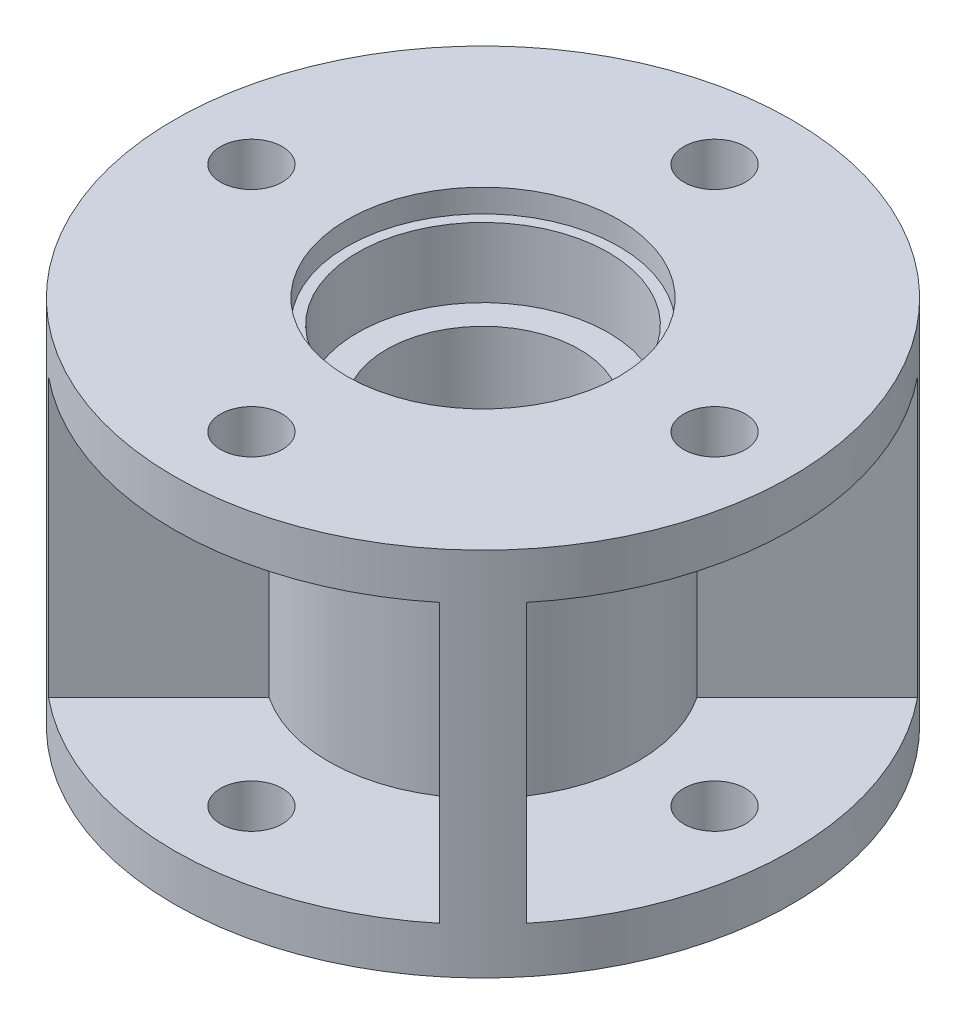
ISO-10303-21;
HEADER;
FILE_DESCRIPTION(('STEP AP214'),'2;1');
FILE_NAME('part.step','',(''),(''),'','','');
FILE_SCHEMA(('AUTOMOTIVE_DESIGN { 1 0 10303 214 1 1 1 1 }'));
ENDSEC;
DATA;
#1=APPLICATION_CONTEXT('core data for automotive mechanical design processes');
#2=APPLICATION_PROTOCOL_DEFINITION('international standard','automotive_design',2000,#1);
#3=PRODUCT_CONTEXT('',#1,'mechanical');
#4=PRODUCT('Part','Part','',(#3));
#5=PRODUCT_RELATED_PRODUCT_CATEGORY('part','',(#4));
#6=PRODUCT_DEFINITION_FORMATION('','',#4);
#7=PRODUCT_DEFINITION_CONTEXT('part definition',#1,'design');
#8=PRODUCT_DEFINITION('design','',#6,#7);
#9=PRODUCT_DEFINITION_SHAPE('','',#8);
#10=(LENGTH_UNIT() NAMED_UNIT(*) SI_UNIT(.MILLI.,.METRE.));
#11=(NAMED_UNIT(*) PLANE_ANGLE_UNIT() SI_UNIT($,.RADIAN.));
#12=(NAMED_UNIT(*) SI_UNIT($,.STERADIAN.) SOLID_ANGLE_UNIT());
#13=UNCERTAINTY_MEASURE_WITH_UNIT(LENGTH_MEASURE(1.E-05),#10,'distance_accuracy_value','');
#14=(GEOMETRIC_REPRESENTATION_CONTEXT(3) GLOBAL_UNCERTAINTY_ASSIGNED_CONTEXT((#13)) GLOBAL_UNIT_ASSIGNED_CONTEXT((#10,
#11,#12)) REPRESENTATION_CONTEXT('',''));
#15=CARTESIAN_POINT('',(0.,0.,0.));
#16=DIRECTION('',(0.,0.,1.));
#17=DIRECTION('',(1.,0.,0.));
#18=AXIS2_PLACEMENT_3D('',#15,#16,#17);
#19=CARTESIAN_POINT('',(0.,36.,0.));
#20=DIRECTION('',(0.,-1.,0.));
#21=DIRECTION('',(0.,0.,-1.));
#22=AXIS2_PLACEMENT_3D('',#19,#20,#21);
#23=CYLINDRICAL_SURFACE('',#22,20.);
#24=CARTESIAN_POINT('',(0.,42.,0.));
#25=DIRECTION('',(0.,1.,0.));
#26=DIRECTION('',(0.,0.,1.));
#27=AXIS2_PLACEMENT_3D('',#24,#25,#26);
#28=CIRCLE('',#27,20.);
#29=CARTESIAN_POINT('',(-11.0279793358048,42.,16.6848335852972));
#30=VERTEX_POINT('',#29);
#31=CARTESIAN_POINT('',(11.0279793358047,42.,16.6848335852973));
#32=VERTEX_POINT('',#31);
#33=EDGE_CURVE('E145',#30,#32,#28,.T.);
#34=ORIENTED_EDGE('',*,*,#33,.F.);
#35=DIRECTION('',(0.,-1.,0.));
#36=VECTOR('',#35,1.);
#37=CARTESIAN_POINT('',(-11.0279793358048,76.2035795419994,16.6848335852972));
#38=LINE('',#37,#36);
#39=CARTESIAN_POINT('',(-11.0279793358048,6.,16.6848335852972));
#40=VERTEX_POINT('',#39);
#41=EDGE_CURVE('E201',#30,#40,#38,.T.);
#42=ORIENTED_EDGE('',*,*,#41,.T.);
#43=CARTESIAN_POINT('',(0.,6.,0.));
#44=DIRECTION('',(0.,1.,0.));
#45=DIRECTION('',(0.,0.,1.));
#46=AXIS2_PLACEMENT_3D('',#43,#44,#45);
#47=CIRCLE('',#46,20.);
#48=CARTESIAN_POINT('',(11.0279793358047,6.,16.6848335852973));
#49=VERTEX_POINT('',#48);
#50=EDGE_CURVE('E170',#40,#49,#47,.T.);
#51=ORIENTED_EDGE('',*,*,#50,.T.);
#52=DIRECTION('',(0.,-1.,0.));
#53=VECTOR('',#52,1.);
#54=CARTESIAN_POINT('',(11.0279793358047,76.2035795419994,16.6848335852973));
#55=LINE('',#54,#53);
#56=EDGE_CURVE('E162',#32,#49,#55,.T.);
#57=ORIENTED_EDGE('',*,*,#56,.F.);
#58=EDGE_LOOP('',(#34,#42,#51,#57));
#59=FACE_BOUND('',#58,.T.);
#60=ADVANCED_FACE('F35',(#59),#23,.T.);
#61=CARTESIAN_POINT('',(16.6848335852971,42.,11.027979335805));
#62=VERTEX_POINT('',#61);
#63=CARTESIAN_POINT('',(16.6848335852973,42.,-11.0279793358048));
#64=VERTEX_POINT('',#63);
#65=EDGE_CURVE('E157',#62,#64,#28,.T.);
#66=ORIENTED_EDGE('',*,*,#65,.F.);
#67=DIRECTION('',(0.,-1.,0.));
#68=VECTOR('',#67,1.);
#69=CARTESIAN_POINT('',(16.6848335852971,76.2035795419994,11.027979335805));
#70=LINE('',#69,#68);
#71=CARTESIAN_POINT('',(16.6848335852971,6.,11.027979335805));
#72=VERTEX_POINT('',#71);
#73=EDGE_CURVE('E172',#62,#72,#70,.T.);
#74=ORIENTED_EDGE('',*,*,#73,.T.);
#75=CARTESIAN_POINT('',(16.6848335852973,6.,-11.0279793358048));
#76=VERTEX_POINT('',#75);
#77=EDGE_CURVE('E236',#72,#76,#47,.T.);
#78=ORIENTED_EDGE('',*,*,#77,.T.);
#79=DIRECTION('',(0.,-1.,0.));
#80=VECTOR('',#79,1.);
#81=CARTESIAN_POINT('',(16.6848335852973,76.2035795419994,-11.0279793358048));
#82=LINE('',#81,#80);
#83=EDGE_CURVE('E192',#64,#76,#82,.T.);
#84=ORIENTED_EDGE('',*,*,#83,.F.);
#85=EDGE_LOOP('',(#66,#74,#78,#84));
#86=FACE_BOUND('',#85,.T.);
#87=ADVANCED_FACE('F349',(#86),#23,.T.);
#88=CARTESIAN_POINT('',(11.0279793358049,42.,-16.6848335852972));
#89=VERTEX_POINT('',#88);
#90=CARTESIAN_POINT('',(-11.0279793358048,42.,-16.6848335852972));
#91=VERTEX_POINT('',#90);
#92=EDGE_CURVE('E350',#89,#91,#28,.T.);
#93=ORIENTED_EDGE('',*,*,#92,.F.);
#94=DIRECTION('',(0.,-1.,0.));
#95=VECTOR('',#94,1.);
#96=CARTESIAN_POINT('',(11.0279793358049,76.2035795419994,-16.6848335852972));
#97=LINE('',#96,#95);
#98=CARTESIAN_POINT('',(11.0279793358049,6.,-16.6848335852972));
#99=VERTEX_POINT('',#98);
#100=EDGE_CURVE('E194',#89,#99,#97,.T.);
#101=ORIENTED_EDGE('',*,*,#100,.T.);
#102=CARTESIAN_POINT('',(-11.0279793358048,6.,-16.6848335852972));
#103=VERTEX_POINT('',#102);
#104=EDGE_CURVE('E306',#99,#103,#47,.T.);
#105=ORIENTED_EDGE('',*,*,#104,.T.);
#106=DIRECTION('',(0.,-1.,0.));
#107=VECTOR('',#106,1.);
#108=CARTESIAN_POINT('',(-11.0279793358048,76.2035795419994,-16.6848335852972));
#109=LINE('',#108,#107);
#110=EDGE_CURVE('E207',#91,#103,#109,.T.);
#111=ORIENTED_EDGE('',*,*,#110,.F.);
#112=EDGE_LOOP('',(#93,#101,#105,#111));
#113=FACE_BOUND('',#112,.T.);
#114=ADVANCED_FACE('F359',(#113),#23,.T.);
#115=CARTESIAN_POINT('',(-16.6848335852972,42.,-11.0279793358049));
#116=VERTEX_POINT('',#115);
#117=CARTESIAN_POINT('',(-16.6848335852972,42.,11.0279793358049));
#118=VERTEX_POINT('',#117);
#119=EDGE_CURVE('E154',#116,#118,#28,.T.);
#120=ORIENTED_EDGE('',*,*,#119,.F.);
#121=DIRECTION('',(0.,-1.,0.));
#122=VECTOR('',#121,1.);
#123=CARTESIAN_POINT('',(-16.6848335852972,76.2035795419994,-11.0279793358049));
#124=LINE('',#123,#122);
#125=CARTESIAN_POINT('',(-16.6848335852972,6.,-11.0279793358049));
#126=VERTEX_POINT('',#125);
#127=EDGE_CURVE('E186',#116,#126,#124,.T.);
#128=ORIENTED_EDGE('',*,*,#127,.T.);
#129=CARTESIAN_POINT('',(-16.6848335852972,6.,11.0279793358049));
#130=VERTEX_POINT('',#129);
#131=EDGE_CURVE('E233',#126,#130,#47,.T.);
#132=ORIENTED_EDGE('',*,*,#131,.T.);
#133=DIRECTION('',(0.,-1.,0.));
#134=VECTOR('',#133,1.);
#135=CARTESIAN_POINT('',(-16.6848335852972,76.2035795419994,11.0279793358049));
#136=LINE('',#135,#134);
#137=EDGE_CURVE('E219',#118,#130,#136,.T.);
#138=ORIENTED_EDGE('',*,*,#137,.F.);
#139=EDGE_LOOP('',(#120,#128,#132,#138));
#140=FACE_BOUND('',#139,.T.);
#141=ADVANCED_FACE('F318',(#140),#23,.T.);
#142=CARTESIAN_POINT('',(-16.6848335852972,76.2035795419994,11.0279793358049));
#143=DIRECTION('',(0.707106781186549,0.,0.707106781186546));
#144=DIRECTION('',(0.707106781186546,0.,-0.707106781186549));
#145=AXIS2_PLACEMENT_3D('',#142,#143,#144);
#146=PLANE('',#145);
#147=DIRECTION('',(-0.707106781186546,0.,0.707106781186549));
#148=VECTOR('',#147,1.);
#149=CARTESIAN_POINT('',(-16.6848335852972,42.,11.0279793358049));
#150=LINE('',#149,#148);
#151=CARTESIAN_POINT('',(-30.9709216836867,42.,25.3140674341945));
#152=VERTEX_POINT('',#151);
#153=EDGE_CURVE('E284',#118,#152,#150,.T.);
#154=ORIENTED_EDGE('',*,*,#153,.F.);
#155=ORIENTED_EDGE('',*,*,#137,.T.);
#156=DIRECTION('',(-0.707106781186546,0.,0.707106781186549));
#157=VECTOR('',#156,1.);
#158=CARTESIAN_POINT('',(-16.6848335852972,6.,11.0279793358049));
#159=LINE('',#158,#157);
#160=CARTESIAN_POINT('',(-30.9709216836867,6.,25.3140674341945));
#161=VERTEX_POINT('',#160);
#162=EDGE_CURVE('E215',#130,#161,#159,.T.);
#163=ORIENTED_EDGE('',*,*,#162,.T.);
#164=DIRECTION('',(0.,-1.,0.));
#165=VECTOR('',#164,1.);
#166=CARTESIAN_POINT('',(-30.9709216836867,76.2035795419994,25.3140674341945));
#167=LINE('',#166,#165);
#168=EDGE_CURVE('E218',#152,#161,#167,.T.);
#169=ORIENTED_EDGE('',*,*,#168,.F.);
#170=EDGE_LOOP('',(#154,#155,#163,#169));
#171=FACE_BOUND('',#170,.T.);
#172=ADVANCED_FACE('F328',(#171),#146,.F.);
#173=CARTESIAN_POINT('',(-11.0279793358048,76.2035795419994,16.6848335852972));
#174=DIRECTION('',(-0.707106781186549,0.,-0.707106781186546));
#175=DIRECTION('',(-0.707106781186546,0.,0.707106781186549));
#176=AXIS2_PLACEMENT_3D('',#173,#174,#175);
#177=PLANE('',#176);
#178=DIRECTION('',(0.707106781186546,0.,-0.707106781186549));
#179=VECTOR('',#178,1.);
#180=CARTESIAN_POINT('',(-11.0279793358048,42.,16.6848335852972));
#181=LINE('',#180,#179);
#182=CARTESIAN_POINT('',(-25.3140674341943,42.,30.9709216836868));
#183=VERTEX_POINT('',#182);
#184=EDGE_CURVE('E150',#183,#30,#181,.T.);
#185=ORIENTED_EDGE('',*,*,#184,.F.);
#186=DIRECTION('',(0.,-1.,0.));
#187=VECTOR('',#186,1.);
#188=CARTESIAN_POINT('',(-25.3140674341943,76.2035795419994,30.9709216836868));
#189=LINE('',#188,#187);
#190=CARTESIAN_POINT('',(-25.3140674341943,6.,30.9709216836868));
#191=VERTEX_POINT('',#190);
#192=EDGE_CURVE('E54',#183,#191,#189,.T.);
#193=ORIENTED_EDGE('',*,*,#192,.T.);
#194=DIRECTION('',(0.707106781186546,0.,-0.707106781186549));
#195=VECTOR('',#194,1.);
#196=CARTESIAN_POINT('',(-11.0279793358048,6.,16.6848335852972));
#197=LINE('',#196,#195);
#198=EDGE_CURVE('E212',#191,#40,#197,.T.);
#199=ORIENTED_EDGE('',*,*,#198,.T.);
#200=ORIENTED_EDGE('',*,*,#41,.F.);
#201=EDGE_LOOP('',(#185,#193,#199,#200));
#202=FACE_BOUND('',#201,.T.);
#203=ADVANCED_FACE('F399',(#202),#177,.F.);
#204=CARTESIAN_POINT('',(-11.0279793358048,76.2035795419994,-16.6848335852972));
#205=DIRECTION('',(-0.707106781186548,0.,0.707106781186547));
#206=DIRECTION('',(0.707106781186547,0.,0.707106781186548));
#207=AXIS2_PLACEMENT_3D('',#204,#205,#206);
#208=PLANE('',#207);
#209=DIRECTION('',(-0.707106781186547,0.,-0.707106781186548));
#210=VECTOR('',#209,1.);
#211=CARTESIAN_POINT('',(-11.0279793358048,42.,-16.6848335852972));
#212=LINE('',#211,#210);
#213=CARTESIAN_POINT('',(-25.3140674341943,42.,-30.9709216836868));
#214=VERTEX_POINT('',#213);
#215=EDGE_CURVE('E281',#91,#214,#212,.T.);
#216=ORIENTED_EDGE('',*,*,#215,.F.);
#217=ORIENTED_EDGE('',*,*,#110,.T.);
#218=DIRECTION('',(-0.707106781186546,0.,-0.707106781186548));
#219=VECTOR('',#218,1.);
#220=CARTESIAN_POINT('',(-11.0279793358048,6.,-16.6848335852972));
#221=LINE('',#220,#219);
#222=CARTESIAN_POINT('',(-25.3140674341943,6.,-30.9709216836868));
#223=VERTEX_POINT('',#222);
#224=EDGE_CURVE('E203',#103,#223,#221,.T.);
#225=ORIENTED_EDGE('',*,*,#224,.T.);
#226=DIRECTION('',(0.,-1.,0.));
#227=VECTOR('',#226,1.);
#228=CARTESIAN_POINT('',(-25.3140674341943,76.2035795419994,-30.9709216836868));
#229=LINE('',#228,#227);
#230=EDGE_CURVE('E206',#214,#223,#229,.T.);
#231=ORIENTED_EDGE('',*,*,#230,.F.);
#232=EDGE_LOOP('',(#216,#217,#225,#231));
#233=FACE_BOUND('',#232,.T.);
#234=ADVANCED_FACE('F358',(#233),#208,.F.);
#235=CARTESIAN_POINT('',(-16.6848335852972,76.2035795419994,-11.0279793358049));
#236=DIRECTION('',(0.707106781186548,0.,-0.707106781186547));
#237=DIRECTION('',(-0.707106781186547,0.,-0.707106781186548));
#238=AXIS2_PLACEMENT_3D('',#235,#236,#237);
#239=PLANE('',#238);
#240=DIRECTION('',(0.707106781186547,0.,0.707106781186548));
#241=VECTOR('',#240,1.);
#242=CARTESIAN_POINT('',(-16.6848335852972,42.,-11.0279793358049));
#243=LINE('',#242,#241);
#244=CARTESIAN_POINT('',(-30.9709216836867,42.,-25.3140674341944));
#245=VERTEX_POINT('',#244);
#246=EDGE_CURVE('E279',#245,#116,#243,.T.);
#247=ORIENTED_EDGE('',*,*,#246,.F.);
#248=DIRECTION('',(0.,-1.,0.));
#249=VECTOR('',#248,1.);
#250=CARTESIAN_POINT('',(-30.9709216836867,76.2035795419994,-25.3140674341944));
#251=LINE('',#250,#249);
#252=CARTESIAN_POINT('',(-30.9709216836867,6.,-25.3140674341944));
#253=VERTEX_POINT('',#252);
#254=EDGE_CURVE('E202',#245,#253,#251,.T.);
#255=ORIENTED_EDGE('',*,*,#254,.T.);
#256=DIRECTION('',(0.707106781186547,0.,0.707106781186548));
#257=VECTOR('',#256,1.);
#258=CARTESIAN_POINT('',(-16.6848335852972,6.,-11.0279793358049));
#259=LINE('',#258,#257);
#260=EDGE_CURVE('E198',#253,#126,#259,.T.);
#261=ORIENTED_EDGE('',*,*,#260,.T.);
#262=ORIENTED_EDGE('',*,*,#127,.F.);
#263=EDGE_LOOP('',(#247,#255,#261,#262));
#264=FACE_BOUND('',#263,.T.);
#265=ADVANCED_FACE('F416',(#264),#239,.F.);
#266=CARTESIAN_POINT('',(16.6848335852973,76.2035795419994,-11.0279793358048));
#267=DIRECTION('',(-0.707106781186544,0.,-0.707106781186551));
#268=DIRECTION('',(-0.707106781186551,0.,0.707106781186544));
#269=AXIS2_PLACEMENT_3D('',#266,#267,#268);
#270=PLANE('',#269);
#271=DIRECTION('',(0.707106781186551,0.,-0.707106781186544));
#272=VECTOR('',#271,1.);
#273=CARTESIAN_POINT('',(16.6848335852973,42.,-11.0279793358048));
#274=LINE('',#273,#272);
#275=CARTESIAN_POINT('',(30.9709216836869,42.,-25.3140674341942));
#276=VERTEX_POINT('',#275);
#277=EDGE_CURVE('E277',#64,#276,#274,.T.);
#278=ORIENTED_EDGE('',*,*,#277,.F.);
#279=ORIENTED_EDGE('',*,*,#83,.T.);
#280=DIRECTION('',(0.707106781186551,0.,-0.707106781186544));
#281=VECTOR('',#280,1.);
#282=CARTESIAN_POINT('',(16.6848335852973,6.,-11.0279793358048));
#283=LINE('',#282,#281);
#284=CARTESIAN_POINT('',(30.9709216836869,6.,-25.3140674341942));
#285=VERTEX_POINT('',#284);
#286=EDGE_CURVE('E188',#76,#285,#283,.T.);
#287=ORIENTED_EDGE('',*,*,#286,.T.);
#288=DIRECTION('',(0.,-1.,0.));
#289=VECTOR('',#288,1.);
#290=CARTESIAN_POINT('',(30.9709216836869,76.2035795419994,-25.3140674341942));
#291=LINE('',#290,#289);
#292=EDGE_CURVE('E191',#276,#285,#291,.T.);
#293=ORIENTED_EDGE('',*,*,#292,.F.);
#294=EDGE_LOOP('',(#278,#279,#287,#293));
#295=FACE_BOUND('',#294,.T.);
#296=ADVANCED_FACE('F347',(#295),#270,.F.);
#297=CARTESIAN_POINT('',(11.0279793358049,76.2035795419994,-16.6848335852972));
#298=DIRECTION('',(0.707106781186544,0.,0.707106781186551));
#299=DIRECTION('',(0.707106781186551,0.,-0.707106781186544));
#300=AXIS2_PLACEMENT_3D('',#297,#298,#299);
#301=PLANE('',#300);
#302=DIRECTION('',(-0.707106781186551,0.,0.707106781186544));
#303=VECTOR('',#302,1.);
#304=CARTESIAN_POINT('',(11.0279793358049,42.,-16.6848335852972));
#305=LINE('',#304,#303);
#306=CARTESIAN_POINT('',(25.3140674341945,42.,-30.9709216836866));
#307=VERTEX_POINT('',#306);
#308=EDGE_CURVE('E165',#307,#89,#305,.T.);
#309=ORIENTED_EDGE('',*,*,#308,.F.);
#310=DIRECTION('',(0.,-1.,0.));
#311=VECTOR('',#310,1.);
#312=CARTESIAN_POINT('',(25.3140674341945,76.2035795419994,-30.9709216836866));
#313=LINE('',#312,#311);
#314=CARTESIAN_POINT('',(25.3140674341945,6.,-30.9709216836866));
#315=VERTEX_POINT('',#314);
#316=EDGE_CURVE('E187',#307,#315,#313,.T.);
#317=ORIENTED_EDGE('',*,*,#316,.T.);
#318=DIRECTION('',(-0.707106781186551,0.,0.707106781186544));
#319=VECTOR('',#318,1.);
#320=CARTESIAN_POINT('',(11.0279793358049,6.,-16.6848335852972));
#321=LINE('',#320,#319);
#322=EDGE_CURVE('E183',#315,#99,#321,.T.);
#323=ORIENTED_EDGE('',*,*,#322,.T.);
#324=ORIENTED_EDGE('',*,*,#100,.F.);
#325=EDGE_LOOP('',(#309,#317,#323,#324));
#326=FACE_BOUND('',#325,.T.);
#327=ADVANCED_FACE('F434',(#326),#301,.F.);
#328=CARTESIAN_POINT('',(11.0279793358047,76.2035795419994,16.6848335852973));
#329=DIRECTION('',(0.707106781186554,0.,-0.707106781186542));
#330=DIRECTION('',(-0.707106781186542,0.,-0.707106781186554));
#331=AXIS2_PLACEMENT_3D('',#328,#329,#330);
#332=PLANE('',#331);
#333=DIRECTION('',(0.707106781186542,0.,0.707106781186554));
#334=VECTOR('',#333,1.);
#335=CARTESIAN_POINT('',(11.0279793358047,42.,16.6848335852973));
#336=LINE('',#335,#334);
#337=CARTESIAN_POINT('',(25.3140674341941,42.,30.970921683687));
#338=VERTEX_POINT('',#337);
#339=EDGE_CURVE('E148',#32,#338,#336,.T.);
#340=ORIENTED_EDGE('',*,*,#339,.F.);
#341=ORIENTED_EDGE('',*,*,#56,.T.);
#342=DIRECTION('',(0.707106781186542,0.,0.707106781186554));
#343=VECTOR('',#342,1.);
#344=CARTESIAN_POINT('',(11.0279793358047,6.,16.6848335852973));
#345=LINE('',#344,#343);
#346=CARTESIAN_POINT('',(25.3140674341941,6.,30.970921683687));
#347=VERTEX_POINT('',#346);
#348=EDGE_CURVE('E171',#49,#347,#345,.T.);
#349=ORIENTED_EDGE('',*,*,#348,.T.);
#350=DIRECTION('',(0.,-1.,0.));
#351=VECTOR('',#350,1.);
#352=CARTESIAN_POINT('',(25.3140674341941,76.2035795419994,30.970921683687));
#353=LINE('',#352,#351);
#354=EDGE_CURVE('E164',#338,#347,#353,.T.);
#355=ORIENTED_EDGE('',*,*,#354,.F.);
#356=EDGE_LOOP('',(#340,#341,#349,#355));
#357=FACE_BOUND('',#356,.T.);
#358=ADVANCED_FACE('F160',(#357),#332,.F.);
#359=CARTESIAN_POINT('',(16.6848335852971,76.2035795419994,11.027979335805));
#360=DIRECTION('',(-0.707106781186553,0.,0.707106781186542));
#361=DIRECTION('',(0.707106781186542,0.,0.707106781186553));
#362=AXIS2_PLACEMENT_3D('',#359,#360,#361);
#363=PLANE('',#362);
#364=DIRECTION('',(-0.707106781186542,0.,-0.707106781186553));
#365=VECTOR('',#364,1.);
#366=CARTESIAN_POINT('',(16.6848335852971,42.,11.027979335805));
#367=LINE('',#366,#365);
#368=CARTESIAN_POINT('',(30.9709216836866,42.,25.3140674341946));
#369=VERTEX_POINT('',#368);
#370=EDGE_CURVE('E11',#369,#62,#367,.T.);
#371=ORIENTED_EDGE('',*,*,#370,.F.);
#372=DIRECTION('',(0.,-1.,0.));
#373=VECTOR('',#372,1.);
#374=CARTESIAN_POINT('',(30.9709216836866,76.2035795419994,25.3140674341946));
#375=LINE('',#374,#373);
#376=CARTESIAN_POINT('',(30.9709216836866,6.,25.3140674341946));
#377=VERTEX_POINT('',#376);
#378=EDGE_CURVE('E180',#369,#377,#375,.T.);
#379=ORIENTED_EDGE('',*,*,#378,.T.);
#380=DIRECTION('',(-0.707106781186542,0.,-0.707106781186553));
#381=VECTOR('',#380,1.);
#382=CARTESIAN_POINT('',(16.6848335852971,6.,11.027979335805));
#383=LINE('',#382,#381);
#384=EDGE_CURVE('E181',#377,#72,#383,.T.);
#385=ORIENTED_EDGE('',*,*,#384,.T.);
#386=ORIENTED_EDGE('',*,*,#73,.F.);
#387=EDGE_LOOP('',(#371,#379,#385,#386));
#388=FACE_BOUND('',#387,.T.);
#389=ADVANCED_FACE('F296',(#388),#363,.F.);
#390=CARTESIAN_POINT('',(0.,48.,0.));
#391=DIRECTION('',(0.,-1.,0.));
#392=DIRECTION('',(0.,0.,-1.));
#393=AXIS2_PLACEMENT_3D('',#390,#391,#392);
#394=CYLINDRICAL_SURFACE('',#393,16.25);
#395=CARTESIAN_POINT('',(0.,36.,0.));
#396=DIRECTION('',(0.,1.,0.));
#397=DIRECTION('',(0.,0.,1.));
#398=AXIS2_PLACEMENT_3D('',#395,#396,#397);
#399=CIRCLE('',#398,16.25);
#400=CARTESIAN_POINT('',(0.,36.,16.25));
#401=VERTEX_POINT('',#400);
#402=EDGE_CURVE('E222',#401,#401,#399,.T.);
#403=ORIENTED_EDGE('',*,*,#402,.F.);
#404=EDGE_LOOP('',(#403));
#405=FACE_BOUND('',#404,.T.);
#406=CARTESIAN_POINT('',(0.,45.,0.));
#407=DIRECTION('',(0.,1.,0.));
#408=DIRECTION('',(0.,0.,1.));
#409=AXIS2_PLACEMENT_3D('',#406,#407,#408);
#410=CIRCLE('',#409,16.25);
#411=CARTESIAN_POINT('',(0.,45.,16.25));
#412=VERTEX_POINT('',#411);
#413=EDGE_CURVE('E175',#412,#412,#410,.T.);
#414=ORIENTED_EDGE('',*,*,#413,.T.);
#415=EDGE_LOOP('',(#414));
#416=FACE_BOUND('',#415,.T.);
#417=ADVANCED_FACE('F460',(#405,#416),#394,.F.);
#418=CARTESIAN_POINT('',(0.,6.,0.));
#419=DIRECTION('',(0.,1.,0.));
#420=DIRECTION('',(0.,0.,1.));
#421=AXIS2_PLACEMENT_3D('',#418,#419,#420);
#422=PLANE('',#421);
#423=CARTESIAN_POINT('',(8.45303402117236E-13,6.,30.));
#424=DIRECTION('',(0.,1.,0.));
#425=DIRECTION('',(0.,0.,1.));
#426=AXIS2_PLACEMENT_3D('',#423,#424,#425);
#427=CIRCLE('',#426,4.00000000000101);
#428=CARTESIAN_POINT('',(8.45303402117236E-13,6.,34.000000000001));
#429=VERTEX_POINT('',#428);
#430=EDGE_CURVE('E259',#429,#429,#427,.F.);
#431=ORIENTED_EDGE('',*,*,#430,.T.);
#432=EDGE_LOOP('',(#431));
#433=FACE_BOUND('',#432,.T.);
#434=CARTESIAN_POINT('',(0.,6.,0.));
#435=DIRECTION('',(0.,1.,0.));
#436=DIRECTION('',(0.,0.,1.));
#437=AXIS2_PLACEMENT_3D('',#434,#435,#436);
#438=CIRCLE('',#437,40.);
#439=EDGE_CURVE('E45',#191,#347,#438,.T.);
#440=ORIENTED_EDGE('',*,*,#439,.T.);
#441=ORIENTED_EDGE('',*,*,#348,.F.);
#442=ORIENTED_EDGE('',*,*,#50,.F.);
#443=ORIENTED_EDGE('',*,*,#198,.F.);
#444=EDGE_LOOP('',(#440,#441,#442,#443));
#445=FACE_BOUND('',#444,.T.);
#446=ADVANCED_FACE('F480',(#433,#445),#422,.T.);
#447=CARTESIAN_POINT('',(30.,6.,1.04744440165294E-13));
#448=DIRECTION('',(0.,1.,0.));
#449=DIRECTION('',(0.,0.,1.));
#450=AXIS2_PLACEMENT_3D('',#447,#448,#449);
#451=CIRCLE('',#450,4.);
#452=CARTESIAN_POINT('',(30.,6.,4.0000000000001));
#453=VERTEX_POINT('',#452);
#454=EDGE_CURVE('E155',#453,#453,#451,.F.);
#455=ORIENTED_EDGE('',*,*,#454,.T.);
#456=EDGE_LOOP('',(#455));
#457=FACE_BOUND('',#456,.T.);
#458=ORIENTED_EDGE('',*,*,#77,.F.);
#459=ORIENTED_EDGE('',*,*,#384,.F.);
#460=EDGE_CURVE('E242',#377,#285,#438,.T.);
#461=ORIENTED_EDGE('',*,*,#460,.T.);
#462=ORIENTED_EDGE('',*,*,#286,.F.);
#463=EDGE_LOOP('',(#458,#459,#461,#462));
#464=FACE_BOUND('',#463,.T.);
#465=ADVANCED_FACE('F303',(#457,#464),#422,.T.);
#466=CARTESIAN_POINT('',(0.,6.,-30.));
#467=DIRECTION('',(0.,1.,0.));
#468=DIRECTION('',(0.,0.,1.));
#469=AXIS2_PLACEMENT_3D('',#466,#467,#468);
#470=CIRCLE('',#469,4.);
#471=CARTESIAN_POINT('',(0.,6.,-26.));
#472=VERTEX_POINT('',#471);
#473=EDGE_CURVE('E256',#472,#472,#470,.F.);
#474=ORIENTED_EDGE('',*,*,#473,.T.);
#475=EDGE_LOOP('',(#474));
#476=FACE_BOUND('',#475,.T.);
#477=ORIENTED_EDGE('',*,*,#104,.F.);
#478=ORIENTED_EDGE('',*,*,#322,.F.);
#479=EDGE_CURVE('E789',#315,#223,#438,.T.);
#480=ORIENTED_EDGE('',*,*,#479,.T.);
#481=ORIENTED_EDGE('',*,*,#224,.F.);
#482=EDGE_LOOP('',(#477,#478,#480,#481));
#483=FACE_BOUND('',#482,.T.);
#484=ADVANCED_FACE('F495',(#476,#483),#422,.T.);
#485=CARTESIAN_POINT('',(-29.9999999999996,6.,4.2632564145606E-13));
#486=DIRECTION('',(0.,1.,0.));
#487=DIRECTION('',(0.,0.,1.));
#488=AXIS2_PLACEMENT_3D('',#485,#486,#487);
#489=CIRCLE('',#488,4.00000000000083);
#490=CARTESIAN_POINT('',(-29.9999999999996,6.,4.00000000000126));
#491=VERTEX_POINT('',#490);
#492=EDGE_CURVE('E252',#491,#491,#489,.F.);
#493=ORIENTED_EDGE('',*,*,#492,.T.);
#494=EDGE_LOOP('',(#493));
#495=FACE_BOUND('',#494,.T.);
#496=ORIENTED_EDGE('',*,*,#131,.F.);
#497=ORIENTED_EDGE('',*,*,#260,.F.);
#498=EDGE_CURVE('E243',#253,#161,#438,.T.);
#499=ORIENTED_EDGE('',*,*,#498,.T.);
#500=ORIENTED_EDGE('',*,*,#162,.F.);
#501=EDGE_LOOP('',(#496,#497,#499,#500));
#502=FACE_BOUND('',#501,.T.);
#503=ADVANCED_FACE('F323',(#495,#502),#422,.T.);
#504=CARTESIAN_POINT('',(0.,36.,0.));
#505=DIRECTION('',(0.,1.,0.));
#506=DIRECTION('',(0.,0.,1.));
#507=AXIS2_PLACEMENT_3D('',#504,#505,#506);
#508=PLANE('',#507);
#509=CARTESIAN_POINT('',(0.,36.,0.));
#510=DIRECTION('',(0.,1.,0.));
#511=DIRECTION('',(0.,0.,1.));
#512=AXIS2_PLACEMENT_3D('',#509,#510,#511);
#513=CIRCLE('',#512,12.5);
#514=CARTESIAN_POINT('',(0.,36.,12.5));
#515=VERTEX_POINT('',#514);
#516=EDGE_CURVE('E230',#515,#515,#513,.T.);
#517=ORIENTED_EDGE('',*,*,#516,.F.);
#518=EDGE_LOOP('',(#517));
#519=FACE_BOUND('',#518,.T.);
#520=ORIENTED_EDGE('',*,*,#402,.T.);
#521=EDGE_LOOP('',(#520));
#522=FACE_BOUND('',#521,.T.);
#523=ADVANCED_FACE('F511',(#519,#522),#508,.T.);
#524=CARTESIAN_POINT('',(0.,0.,0.));
#525=DIRECTION('',(0.,1.,0.));
#526=DIRECTION('',(0.,0.,1.));
#527=AXIS2_PLACEMENT_3D('',#524,#525,#526);
#528=PLANE('',#527);
#529=CARTESIAN_POINT('',(0.,0.,-30.));
#530=DIRECTION('',(0.,1.,0.));
#531=DIRECTION('',(0.,0.,1.));
#532=AXIS2_PLACEMENT_3D('',#529,#530,#531);
#533=CIRCLE('',#532,4.);
#534=CARTESIAN_POINT('',(0.,0.,-26.));
#535=VERTEX_POINT('',#534);
#536=EDGE_CURVE('E729',#535,#535,#533,.T.);
#537=ORIENTED_EDGE('',*,*,#536,.T.);
#538=EDGE_LOOP('',(#537));
#539=FACE_BOUND('',#538,.T.);
#540=CARTESIAN_POINT('',(30.,0.,1.04744440165294E-13));
#541=DIRECTION('',(0.,1.,0.));
#542=DIRECTION('',(0.,0.,1.));
#543=AXIS2_PLACEMENT_3D('',#540,#541,#542);
#544=CIRCLE('',#543,4.);
#545=CARTESIAN_POINT('',(30.,0.,4.0000000000001));
#546=VERTEX_POINT('',#545);
#547=EDGE_CURVE('E735',#546,#546,#544,.T.);
#548=ORIENTED_EDGE('',*,*,#547,.T.);
#549=EDGE_LOOP('',(#548));
#550=FACE_BOUND('',#549,.T.);
#551=CARTESIAN_POINT('',(8.45303402117236E-13,0.,30.));
#552=DIRECTION('',(0.,1.,0.));
#553=DIRECTION('',(0.,0.,1.));
#554=AXIS2_PLACEMENT_3D('',#551,#552,#553);
#555=CIRCLE('',#554,4.00000000000101);
#556=CARTESIAN_POINT('',(8.45303402117236E-13,0.,34.000000000001));
#557=VERTEX_POINT('',#556);
#558=EDGE_CURVE('E741',#557,#557,#555,.T.);
#559=ORIENTED_EDGE('',*,*,#558,.T.);
#560=EDGE_LOOP('',(#559));
#561=FACE_BOUND('',#560,.T.);
#562=CARTESIAN_POINT('',(-29.9999999999996,0.,4.2632564145606E-13));
#563=DIRECTION('',(0.,1.,0.));
#564=DIRECTION('',(0.,0.,1.));
#565=AXIS2_PLACEMENT_3D('',#562,#563,#564);
#566=CIRCLE('',#565,4.00000000000083);
#567=CARTESIAN_POINT('',(-29.9999999999996,0.,4.00000000000126));
#568=VERTEX_POINT('',#567);
#569=EDGE_CURVE('E747',#568,#568,#566,.T.);
#570=ORIENTED_EDGE('',*,*,#569,.T.);
#571=EDGE_LOOP('',(#570));
#572=FACE_BOUND('',#571,.T.);
#573=CARTESIAN_POINT('',(0.,0.,0.));
#574=DIRECTION('',(0.,1.,0.));
#575=DIRECTION('',(0.,0.,1.));
#576=AXIS2_PLACEMENT_3D('',#573,#574,#575);
#577=CIRCLE('',#576,40.);
#578=CARTESIAN_POINT('',(0.,0.,40.));
#579=VERTEX_POINT('',#578);
#580=EDGE_CURVE('E239',#579,#579,#577,.T.);
#581=ORIENTED_EDGE('',*,*,#580,.F.);
#582=EDGE_LOOP('',(#581));
#583=FACE_BOUND('',#582,.T.);
#584=CARTESIAN_POINT('',(0.,0.,0.));
#585=DIRECTION('',(0.,1.,0.));
#586=DIRECTION('',(0.,0.,1.));
#587=AXIS2_PLACEMENT_3D('',#584,#585,#586);
#588=CIRCLE('',#587,12.5);
#589=CARTESIAN_POINT('',(0.,0.,12.5));
#590=VERTEX_POINT('',#589);
#591=EDGE_CURVE('E235',#590,#590,#588,.T.);
#592=ORIENTED_EDGE('',*,*,#591,.T.);
#593=EDGE_LOOP('',(#592));
#594=FACE_BOUND('',#593,.T.);
#595=ADVANCED_FACE('F472',(#539,#550,#561,#572,#583,#594),#528,.F.);
#596=CARTESIAN_POINT('',(0.,6.,0.));
#597=DIRECTION('',(0.,-1.,0.));
#598=DIRECTION('',(0.,0.,-1.));
#599=AXIS2_PLACEMENT_3D('',#596,#597,#598);
#600=CYLINDRICAL_SURFACE('',#599,40.);
#601=ORIENTED_EDGE('',*,*,#378,.F.);
#602=CARTESIAN_POINT('',(0.,42.,0.));
#603=DIRECTION('',(0.,1.,0.));
#604=DIRECTION('',(0.,0.,1.));
#605=AXIS2_PLACEMENT_3D('',#602,#603,#604);
#606=CIRCLE('',#605,40.);
#607=EDGE_CURVE('E166',#369,#276,#606,.T.);
#608=ORIENTED_EDGE('',*,*,#607,.T.);
#609=ORIENTED_EDGE('',*,*,#292,.T.);
#610=ORIENTED_EDGE('',*,*,#460,.F.);
#611=EDGE_LOOP('',(#601,#608,#609,#610));
#612=FACE_BOUND('',#611,.T.);
#613=ORIENTED_EDGE('',*,*,#316,.F.);
#614=EDGE_CURVE('E336',#307,#214,#606,.T.);
#615=ORIENTED_EDGE('',*,*,#614,.T.);
#616=ORIENTED_EDGE('',*,*,#230,.T.);
#617=ORIENTED_EDGE('',*,*,#479,.F.);
#618=EDGE_LOOP('',(#613,#615,#616,#617));
#619=FACE_BOUND('',#618,.T.);
#620=ORIENTED_EDGE('',*,*,#254,.F.);
#621=EDGE_CURVE('E274',#245,#152,#606,.T.);
#622=ORIENTED_EDGE('',*,*,#621,.T.);
#623=ORIENTED_EDGE('',*,*,#168,.T.);
#624=ORIENTED_EDGE('',*,*,#498,.F.);
#625=EDGE_LOOP('',(#620,#622,#623,#624));
#626=FACE_BOUND('',#625,.T.);
#627=EDGE_CURVE('E273',#183,#338,#606,.T.);
#628=ORIENTED_EDGE('',*,*,#627,.T.);
#629=ORIENTED_EDGE('',*,*,#354,.T.);
#630=ORIENTED_EDGE('',*,*,#439,.F.);
#631=ORIENTED_EDGE('',*,*,#192,.F.);
#632=EDGE_LOOP('',(#628,#629,#630,#631));
#633=FACE_BOUND('',#632,.T.);
#634=CARTESIAN_POINT('',(0.,48.,0.));
#635=DIRECTION('',(0.,1.,0.));
#636=DIRECTION('',(0.,0.,1.));
#637=AXIS2_PLACEMENT_3D('',#634,#635,#636);
#638=CIRCLE('',#637,40.);
#639=CARTESIAN_POINT('',(0.,48.,40.));
#640=VERTEX_POINT('',#639);
#641=EDGE_CURVE('E214',#640,#640,#638,.T.);
#642=ORIENTED_EDGE('',*,*,#641,.F.);
#643=EDGE_LOOP('',(#642));
#644=FACE_BOUND('',#643,.T.);
#645=ORIENTED_EDGE('',*,*,#580,.T.);
#646=EDGE_LOOP('',(#645));
#647=FACE_BOUND('',#646,.T.);
#648=ADVANCED_FACE('F37',(#612,#619,#626,#633,#644,#647),#600,.T.);
#649=CARTESIAN_POINT('',(0.,6.,0.));
#650=DIRECTION('',(0.,-1.,0.));
#651=DIRECTION('',(0.,0.,-1.));
#652=AXIS2_PLACEMENT_3D('',#649,#650,#651);
#653=CYLINDRICAL_SURFACE('',#652,12.5);
#654=ORIENTED_EDGE('',*,*,#591,.F.);
#655=EDGE_LOOP('',(#654));
#656=FACE_BOUND('',#655,.T.);
#657=ORIENTED_EDGE('',*,*,#516,.T.);
#658=EDGE_LOOP('',(#657));
#659=FACE_BOUND('',#658,.T.);
#660=ADVANCED_FACE('F471',(#656,#659),#653,.F.);
#661=CARTESIAN_POINT('',(0.,48.,0.));
#662=DIRECTION('',(0.,1.,0.));
#663=DIRECTION('',(0.,0.,1.));
#664=AXIS2_PLACEMENT_3D('',#661,#662,#663);
#665=PLANE('',#664);
#666=CARTESIAN_POINT('',(0.,48.,-30.));
#667=DIRECTION('',(0.,1.,0.));
#668=DIRECTION('',(0.,0.,1.));
#669=AXIS2_PLACEMENT_3D('',#666,#667,#668);
#670=CIRCLE('',#669,4.);
#671=CARTESIAN_POINT('',(0.,48.,-26.));
#672=VERTEX_POINT('',#671);
#673=EDGE_CURVE('E253',#672,#672,#670,.T.);
#674=ORIENTED_EDGE('',*,*,#673,.F.);
#675=EDGE_LOOP('',(#674));
#676=FACE_BOUND('',#675,.T.);
#677=CARTESIAN_POINT('',(30.,48.,1.04744440165294E-13));
#678=DIRECTION('',(0.,1.,0.));
#679=DIRECTION('',(0.,0.,1.));
#680=AXIS2_PLACEMENT_3D('',#677,#678,#679);
#681=CIRCLE('',#680,4.);
#682=CARTESIAN_POINT('',(30.,48.,4.0000000000001));
#683=VERTEX_POINT('',#682);
#684=EDGE_CURVE('E730',#683,#683,#681,.T.);
#685=ORIENTED_EDGE('',*,*,#684,.F.);
#686=EDGE_LOOP('',(#685));
#687=FACE_BOUND('',#686,.T.);
#688=CARTESIAN_POINT('',(8.45303402117236E-13,48.,30.));
#689=DIRECTION('',(0.,1.,0.));
#690=DIRECTION('',(0.,0.,1.));
#691=AXIS2_PLACEMENT_3D('',#688,#689,#690);
#692=CIRCLE('',#691,4.00000000000101);
#693=CARTESIAN_POINT('',(8.45303402117236E-13,48.,34.000000000001));
#694=VERTEX_POINT('',#693);
#695=EDGE_CURVE('E739',#694,#694,#692,.T.);
#696=ORIENTED_EDGE('',*,*,#695,.F.);
#697=EDGE_LOOP('',(#696));
#698=FACE_BOUND('',#697,.T.);
#699=CARTESIAN_POINT('',(-29.9999999999996,48.,4.2632564145606E-13));
#700=DIRECTION('',(0.,1.,0.));
#701=DIRECTION('',(0.,0.,1.));
#702=AXIS2_PLACEMENT_3D('',#699,#700,#701);
#703=CIRCLE('',#702,4.00000000000083);
#704=CARTESIAN_POINT('',(-29.9999999999996,48.,4.00000000000126));
#705=VERTEX_POINT('',#704);
#706=EDGE_CURVE('E744',#705,#705,#703,.T.);
#707=ORIENTED_EDGE('',*,*,#706,.F.);
#708=EDGE_LOOP('',(#707));
#709=FACE_BOUND('',#708,.T.);
#710=ORIENTED_EDGE('',*,*,#641,.T.);
#711=EDGE_LOOP('',(#710));
#712=FACE_BOUND('',#711,.T.);
#713=CARTESIAN_POINT('',(0.,48.,0.));
#714=DIRECTION('',(0.,1.,0.));
#715=DIRECTION('',(0.,0.,1.));
#716=AXIS2_PLACEMENT_3D('',#713,#714,#715);
#717=CIRCLE('',#716,17.6);
#718=CARTESIAN_POINT('',(0.,48.,17.6));
#719=VERTEX_POINT('',#718);
#720=EDGE_CURVE('E286',#719,#719,#717,.T.);
#721=ORIENTED_EDGE('',*,*,#720,.F.);
#722=EDGE_LOOP('',(#721));
#723=FACE_BOUND('',#722,.T.);
#724=ADVANCED_FACE('F526',(#676,#687,#698,#709,#712,#723),#665,.T.);
#725=CARTESIAN_POINT('',(0.,45.,0.));
#726=DIRECTION('',(0.,1.,0.));
#727=DIRECTION('',(0.,0.,1.));
#728=AXIS2_PLACEMENT_3D('',#725,#726,#727);
#729=CYLINDRICAL_SURFACE('',#728,17.6);
#730=CARTESIAN_POINT('',(0.,45.,0.));
#731=DIRECTION('',(0.,1.,0.));
#732=DIRECTION('',(0.,0.,1.));
#733=AXIS2_PLACEMENT_3D('',#730,#731,#732);
#734=CIRCLE('',#733,17.6);
#735=CARTESIAN_POINT('',(0.,45.,17.6));
#736=VERTEX_POINT('',#735);
#737=EDGE_CURVE('E247',#736,#736,#734,.T.);
#738=ORIENTED_EDGE('',*,*,#737,.F.);
#739=EDGE_LOOP('',(#738));
#740=FACE_BOUND('',#739,.T.);
#741=ORIENTED_EDGE('',*,*,#720,.T.);
#742=EDGE_LOOP('',(#741));
#743=FACE_BOUND('',#742,.T.);
#744=ADVANCED_FACE('F530',(#740,#743),#729,.F.);
#745=CARTESIAN_POINT('',(0.,45.,0.));
#746=DIRECTION('',(0.,1.,0.));
#747=DIRECTION('',(0.,0.,1.));
#748=AXIS2_PLACEMENT_3D('',#745,#746,#747);
#749=PLANE('',#748);
#750=ORIENTED_EDGE('',*,*,#413,.F.);
#751=EDGE_LOOP('',(#750));
#752=FACE_BOUND('',#751,.T.);
#753=ORIENTED_EDGE('',*,*,#737,.T.);
#754=EDGE_LOOP('',(#753));
#755=FACE_BOUND('',#754,.T.);
#756=ADVANCED_FACE('F543',(#752,#755),#749,.T.);
#757=CARTESIAN_POINT('',(0.,42.,0.));
#758=DIRECTION('',(0.,1.,0.));
#759=DIRECTION('',(0.,0.,1.));
#760=AXIS2_PLACEMENT_3D('',#757,#758,#759);
#761=PLANE('',#760);
#762=CARTESIAN_POINT('',(30.,42.,1.04744440165294E-13));
#763=DIRECTION('',(0.,1.,0.));
#764=DIRECTION('',(0.,0.,1.));
#765=AXIS2_PLACEMENT_3D('',#762,#763,#764);
#766=CIRCLE('',#765,4.);
#767=CARTESIAN_POINT('',(30.,42.,4.0000000000001));
#768=VERTEX_POINT('',#767);
#769=EDGE_CURVE('E39',#768,#768,#766,.F.);
#770=ORIENTED_EDGE('',*,*,#769,.F.);
#771=EDGE_LOOP('',(#770));
#772=FACE_BOUND('',#771,.T.);
#773=ORIENTED_EDGE('',*,*,#65,.T.);
#774=ORIENTED_EDGE('',*,*,#277,.T.);
#775=ORIENTED_EDGE('',*,*,#607,.F.);
#776=ORIENTED_EDGE('',*,*,#370,.T.);
#777=EDGE_LOOP('',(#773,#774,#775,#776));
#778=FACE_BOUND('',#777,.T.);
#779=ADVANCED_FACE('F539',(#772,#778),#761,.F.);
#780=CARTESIAN_POINT('',(8.45303402117236E-13,42.,30.));
#781=DIRECTION('',(0.,1.,0.));
#782=DIRECTION('',(0.,0.,1.));
#783=AXIS2_PLACEMENT_3D('',#780,#781,#782);
#784=CIRCLE('',#783,4.00000000000101);
#785=CARTESIAN_POINT('',(8.45303402117236E-13,42.,34.000000000001));
#786=VERTEX_POINT('',#785);
#787=EDGE_CURVE('E257',#786,#786,#784,.F.);
#788=ORIENTED_EDGE('',*,*,#787,.F.);
#789=EDGE_LOOP('',(#788));
#790=FACE_BOUND('',#789,.T.);
#791=ORIENTED_EDGE('',*,*,#627,.F.);
#792=ORIENTED_EDGE('',*,*,#184,.T.);
#793=ORIENTED_EDGE('',*,*,#33,.T.);
#794=ORIENTED_EDGE('',*,*,#339,.T.);
#795=EDGE_LOOP('',(#791,#792,#793,#794));
#796=FACE_BOUND('',#795,.T.);
#797=ADVANCED_FACE('F147',(#790,#796),#761,.F.);
#798=CARTESIAN_POINT('',(0.,42.,-30.));
#799=DIRECTION('',(0.,1.,0.));
#800=DIRECTION('',(0.,0.,1.));
#801=AXIS2_PLACEMENT_3D('',#798,#799,#800);
#802=CIRCLE('',#801,4.);
#803=CARTESIAN_POINT('',(0.,42.,-26.));
#804=VERTEX_POINT('',#803);
#805=EDGE_CURVE('E254',#804,#804,#802,.F.);
#806=ORIENTED_EDGE('',*,*,#805,.F.);
#807=EDGE_LOOP('',(#806));
#808=FACE_BOUND('',#807,.T.);
#809=ORIENTED_EDGE('',*,*,#92,.T.);
#810=ORIENTED_EDGE('',*,*,#215,.T.);
#811=ORIENTED_EDGE('',*,*,#614,.F.);
#812=ORIENTED_EDGE('',*,*,#308,.T.);
#813=EDGE_LOOP('',(#809,#810,#811,#812));
#814=FACE_BOUND('',#813,.T.);
#815=ADVANCED_FACE('F354',(#808,#814),#761,.F.);
#816=CARTESIAN_POINT('',(-29.9999999999996,42.,4.2632564145606E-13));
#817=DIRECTION('',(0.,1.,0.));
#818=DIRECTION('',(0.,0.,1.));
#819=AXIS2_PLACEMENT_3D('',#816,#817,#818);
#820=CIRCLE('',#819,4.00000000000083);
#821=CARTESIAN_POINT('',(-29.9999999999996,42.,4.00000000000126));
#822=VERTEX_POINT('',#821);
#823=EDGE_CURVE('E249',#822,#822,#820,.F.);
#824=ORIENTED_EDGE('',*,*,#823,.F.);
#825=EDGE_LOOP('',(#824));
#826=FACE_BOUND('',#825,.T.);
#827=ORIENTED_EDGE('',*,*,#119,.T.);
#828=ORIENTED_EDGE('',*,*,#153,.T.);
#829=ORIENTED_EDGE('',*,*,#621,.F.);
#830=ORIENTED_EDGE('',*,*,#246,.T.);
#831=EDGE_LOOP('',(#827,#828,#829,#830));
#832=FACE_BOUND('',#831,.T.);
#833=ADVANCED_FACE('F331',(#826,#832),#761,.F.);
#834=CARTESIAN_POINT('',(-29.9999999999996,59.3137084989876,4.2632564145606E-13));
#835=DIRECTION('',(0.,-1.,0.));
#836=DIRECTION('',(0.,0.,-1.));
#837=AXIS2_PLACEMENT_3D('',#834,#835,#836);
#838=CYLINDRICAL_SURFACE('',#837,4.00000000000083);
#839=ORIENTED_EDGE('',*,*,#706,.T.);
#840=EDGE_LOOP('',(#839));
#841=FACE_BOUND('',#840,.T.);
#842=ORIENTED_EDGE('',*,*,#823,.T.);
#843=EDGE_LOOP('',(#842));
#844=FACE_BOUND('',#843,.T.);
#845=ADVANCED_FACE('F570',(#841,#844),#838,.F.);
#846=CARTESIAN_POINT('',(0.,59.3137084989876,-30.));
#847=DIRECTION('',(0.,-1.,0.));
#848=DIRECTION('',(0.,0.,-1.));
#849=AXIS2_PLACEMENT_3D('',#846,#847,#848);
#850=CYLINDRICAL_SURFACE('',#849,4.);
#851=ORIENTED_EDGE('',*,*,#673,.T.);
#852=EDGE_LOOP('',(#851));
#853=FACE_BOUND('',#852,.T.);
#854=ORIENTED_EDGE('',*,*,#805,.T.);
#855=EDGE_LOOP('',(#854));
#856=FACE_BOUND('',#855,.T.);
#857=ADVANCED_FACE('F579',(#853,#856),#850,.F.);
#858=CARTESIAN_POINT('',(8.45303402117236E-13,59.3137084989876,30.));
#859=DIRECTION('',(0.,-1.,0.));
#860=DIRECTION('',(0.,0.,-1.));
#861=AXIS2_PLACEMENT_3D('',#858,#859,#860);
#862=CYLINDRICAL_SURFACE('',#861,4.00000000000101);
#863=ORIENTED_EDGE('',*,*,#695,.T.);
#864=EDGE_LOOP('',(#863));
#865=FACE_BOUND('',#864,.T.);
#866=ORIENTED_EDGE('',*,*,#787,.T.);
#867=EDGE_LOOP('',(#866));
#868=FACE_BOUND('',#867,.T.);
#869=ADVANCED_FACE('F590',(#865,#868),#862,.F.);
#870=CARTESIAN_POINT('',(30.,59.3137084989876,1.04744440165294E-13));
#871=DIRECTION('',(0.,-1.,0.));
#872=DIRECTION('',(0.,0.,-1.));
#873=AXIS2_PLACEMENT_3D('',#870,#871,#872);
#874=CYLINDRICAL_SURFACE('',#873,4.);
#875=ORIENTED_EDGE('',*,*,#684,.T.);
#876=EDGE_LOOP('',(#875));
#877=FACE_BOUND('',#876,.T.);
#878=ORIENTED_EDGE('',*,*,#769,.T.);
#879=EDGE_LOOP('',(#878));
#880=FACE_BOUND('',#879,.T.);
#881=ADVANCED_FACE('F601',(#877,#880),#874,.F.);
#882=ORIENTED_EDGE('',*,*,#492,.F.);
#883=EDGE_LOOP('',(#882));
#884=FACE_BOUND('',#883,.T.);
#885=ORIENTED_EDGE('',*,*,#569,.F.);
#886=EDGE_LOOP('',(#885));
#887=FACE_BOUND('',#886,.T.);
#888=ADVANCED_FACE('F582',(#884,#887),#838,.F.);
#889=ORIENTED_EDGE('',*,*,#430,.F.);
#890=EDGE_LOOP('',(#889));
#891=FACE_BOUND('',#890,.T.);
#892=ORIENTED_EDGE('',*,*,#558,.F.);
#893=EDGE_LOOP('',(#892));
#894=FACE_BOUND('',#893,.T.);
#895=ADVANCED_FACE('F604',(#891,#894),#862,.F.);
#896=ORIENTED_EDGE('',*,*,#454,.F.);
#897=EDGE_LOOP('',(#896));
#898=FACE_BOUND('',#897,.T.);
#899=ORIENTED_EDGE('',*,*,#547,.F.);
#900=EDGE_LOOP('',(#899));
#901=FACE_BOUND('',#900,.T.);
#902=ADVANCED_FACE('F614',(#898,#901),#874,.F.);
#903=ORIENTED_EDGE('',*,*,#473,.F.);
#904=EDGE_LOOP('',(#903));
#905=FACE_BOUND('',#904,.T.);
#906=ORIENTED_EDGE('',*,*,#536,.F.);
#907=EDGE_LOOP('',(#906));
#908=FACE_BOUND('',#907,.T.);
#909=ADVANCED_FACE('F593',(#905,#908),#850,.F.);
#910=CLOSED_SHELL('',(#60,#87,#114,#141,#172,#203,#234,#265,#296,#327,#358,#389,#417,#446,#465,
#484,#503,#523,#595,#648,#660,#724,#744,#756,#779,#797,#815,#833,#845,#857,#869,#881,#888,#895,
#902,#909));
#911=MANIFOLD_SOLID_BREP('B2',#910);
#912=ADVANCED_BREP_SHAPE_REPRESENTATION('',(#18,#911),#14);
#913=SHAPE_DEFINITION_REPRESENTATION(#9,#912);
ENDSEC;
END-ISO-10303-21;
